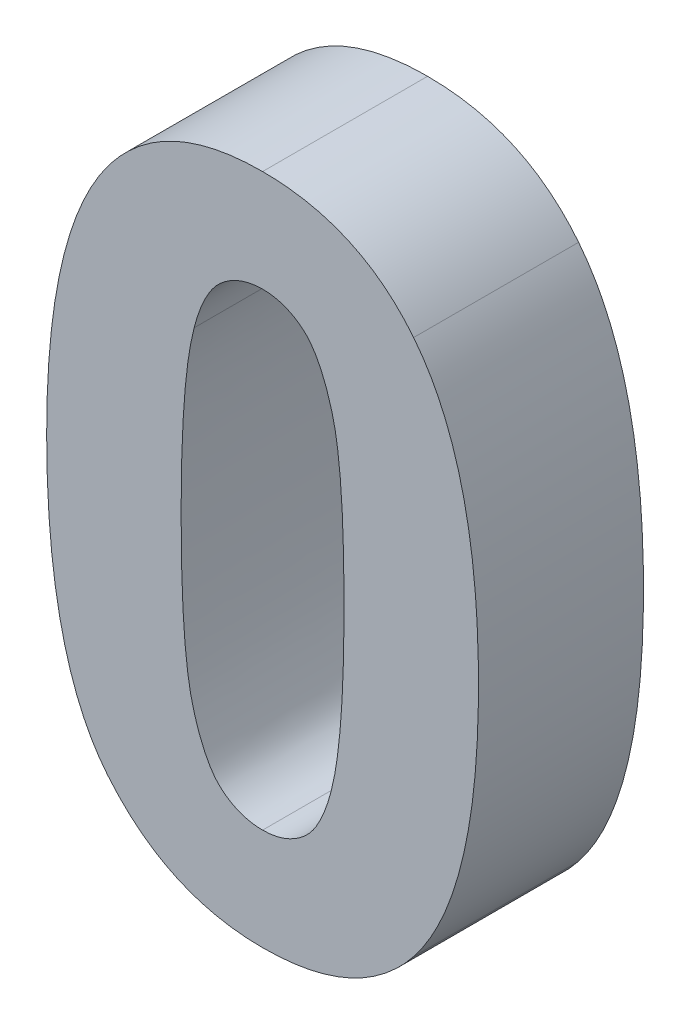
ISO-10303-21;
HEADER;
FILE_DESCRIPTION(('STEP AP214'),'2;1');
FILE_NAME('part.step','',(''),(''),'','','');
FILE_SCHEMA(('AUTOMOTIVE_DESIGN { 1 0 10303 214 1 1 1 1 }'));
ENDSEC;
DATA;
#1=APPLICATION_CONTEXT('core data for automotive mechanical design processes');
#2=APPLICATION_PROTOCOL_DEFINITION('international standard','automotive_design',2000,#1);
#3=PRODUCT_CONTEXT('',#1,'mechanical');
#4=PRODUCT('Part','Part','',(#3));
#5=PRODUCT_RELATED_PRODUCT_CATEGORY('part','',(#4));
#6=PRODUCT_DEFINITION_FORMATION('','',#4);
#7=PRODUCT_DEFINITION_CONTEXT('part definition',#1,'design');
#8=PRODUCT_DEFINITION('design','',#6,#7);
#9=PRODUCT_DEFINITION_SHAPE('','',#8);
#10=(LENGTH_UNIT() NAMED_UNIT(*) SI_UNIT(.MILLI.,.METRE.));
#11=(NAMED_UNIT(*) PLANE_ANGLE_UNIT() SI_UNIT($,.RADIAN.));
#12=(NAMED_UNIT(*) SI_UNIT($,.STERADIAN.) SOLID_ANGLE_UNIT());
#13=UNCERTAINTY_MEASURE_WITH_UNIT(LENGTH_MEASURE(1.E-05),#10,'distance_accuracy_value','');
#14=(GEOMETRIC_REPRESENTATION_CONTEXT(3) GLOBAL_UNCERTAINTY_ASSIGNED_CONTEXT((#13)) GLOBAL_UNIT_ASSIGNED_CONTEXT((#10,
#11,#12)) REPRESENTATION_CONTEXT('',''));
#15=CARTESIAN_POINT('',(0.,0.,0.));
#16=DIRECTION('',(0.,0.,1.));
#17=DIRECTION('',(1.,0.,0.));
#18=AXIS2_PLACEMENT_3D('',#15,#16,#17);
#19=CARTESIAN_POINT('',(0.412203937068,0.113162769524,0.774985954115));
#20=DIRECTION('',(0.,0.,1.));
#21=DIRECTION('',(1.,0.,0.));
#22=AXIS2_PLACEMENT_3D('',#19,#20,#21);
#23=PLANE('',#22);
#24=CARTESIAN_POINT('',(0.543068134599,0.113162769524,0.774985954115));
#25=CARTESIAN_POINT('',(0.601632976493,0.113162769524,0.774985954115));
#26=CARTESIAN_POINT('',(0.634349035295,0.153980690774,0.774985954115));
#27=B_SPLINE_CURVE_WITH_KNOTS('',2,(#24,#25,#26),.UNSPECIFIED.,.F.,.F.,(3,3),(0.,1.),.UNSPECIFIED.);
#28=CARTESIAN_POINT('',(0.634349035295,0.153980690774,0.774985954115));
#29=VERTEX_POINT('',#28);
#30=CARTESIAN_POINT('',(0.543068134599,0.113162769524,0.774985954115));
#31=VERTEX_POINT('',#30);
#32=EDGE_CURVE('E160',#29,#31,#27,.F.);
#33=ORIENTED_EDGE('',*,*,#32,.F.);
#34=CARTESIAN_POINT('',(0.634619063468,0.479212161659,0.774985954115));
#35=CARTESIAN_POINT('',(0.640025402949176,0.472447419636685,0.774985954115));
#36=CARTESIAN_POINT('',(0.644611120418053,0.465147016002518,0.774985954115));
#37=CARTESIAN_POINT('',(0.652388335620454,0.449985067460644,0.774985954115));
#38=CARTESIAN_POINT('',(0.6556027750927,0.442135543387871,0.774985954115));
#39=CARTESIAN_POINT('',(0.663133811607039,0.420002062466839,0.774985954115));
#40=CARTESIAN_POINT('',(0.666414112109756,0.405386985115071,0.774985954115));
#41=CARTESIAN_POINT('',(0.67110864527515,0.375726196064851,0.774985954115));
#42=CARTESIAN_POINT('',(0.672498987227943,0.360677383301054,0.774985954115));
#43=CARTESIAN_POINT('',(0.673734050783575,0.335716440770398,0.774985954115));
#44=CARTESIAN_POINT('',(0.673946137324681,0.325819874262729,0.774985954115));
#45=CARTESIAN_POINT('',(0.673917574717606,0.306035237575412,0.774985954115));
#46=CARTESIAN_POINT('',(0.673677038163963,0.29614716589475,0.774985954115));
#47=CARTESIAN_POINT('',(0.672119723713211,0.266583677793478,0.774985954115));
#48=CARTESIAN_POINT('',(0.669972992035096,0.246913758388927,0.774985954115));
#49=CARTESIAN_POINT('',(0.663875359600649,0.218071954697812,0.774985954115));
#50=CARTESIAN_POINT('',(0.661376402943102,0.208599284598992,0.774985954115));
#51=CARTESIAN_POINT('',(0.655070453749767,0.190116325194422,0.774985954115));
#52=CARTESIAN_POINT('',(0.651270996941365,0.181103708421494,0.774985954115));
#53=CARTESIAN_POINT('',(0.643055594048154,0.166053464373779,0.774985954115));
#54=CARTESIAN_POINT('',(0.638998054530759,0.159816398554605,0.774985954115));
#55=CARTESIAN_POINT('',(0.634349035302135,0.15398069078293,0.774985954115));
#56=B_SPLINE_CURVE_WITH_KNOTS('',3,(#34,#35,#36,#37,#38,#39,#40,#41,#42,#43,#44,#45,#46,#47,#48,
#49,#50,#51,#52,#53,#54,#55),.UNSPECIFIED.,.F.,.F.,(4,2,2,2,2,2,2,2,2,2,4),(0.,
0.0257890190373717,0.0511278323204593,0.0958393905091153,0.141111043835148,0.170793939050839,
0.200469451324563,0.259534837633241,0.288870897633903,0.318039769929468,0.340309059718944),.UNSPECIFIED.);
#57=CARTESIAN_POINT('',(0.634619063468,0.479212161659,0.774985954115));
#58=VERTEX_POINT('',#57);
#59=EDGE_CURVE('E164',#58,#29,#56,.T.);
#60=ORIENTED_EDGE('',*,*,#59,.F.);
#61=CARTESIAN_POINT('',(0.634619063468,0.479212161659,0.774985954115));
#62=CARTESIAN_POINT('',(0.601632976493,0.520570176931,0.774985954115));
#63=CARTESIAN_POINT('',(0.543068134599,0.520570176931,0.774985954115));
#64=B_SPLINE_CURVE_WITH_KNOTS('',2,(#61,#62,#63),.UNSPECIFIED.,.F.,.F.,(3,3),(0.,1.),.UNSPECIFIED.);
#65=CARTESIAN_POINT('',(0.543068134599,0.520570176931,0.774985954115));
#66=VERTEX_POINT('',#65);
#67=EDGE_CURVE('E151',#66,#58,#64,.F.);
#68=ORIENTED_EDGE('',*,*,#67,.F.);
#69=CARTESIAN_POINT('',(0.543068134599,0.520570176931,0.774985954115));
#70=CARTESIAN_POINT('',(0.48450333038,0.520570176931,0.774985954115));
#71=CARTESIAN_POINT('',(0.451787271578,0.479752293358,0.774985954115));
#72=B_SPLINE_CURVE_WITH_KNOTS('',2,(#69,#70,#71),.UNSPECIFIED.,.F.,.F.,(3,3),(0.,1.),.UNSPECIFIED.);
#73=CARTESIAN_POINT('',(0.451787271578,0.479752293358,0.774985954115));
#74=VERTEX_POINT('',#73);
#75=EDGE_CURVE('E156',#74,#66,#72,.F.);
#76=ORIENTED_EDGE('',*,*,#75,.F.);
#77=CARTESIAN_POINT('',(0.543068134599,0.113162769524,0.774985954115));
#78=CARTESIAN_POINT('',(0.53603659712938,0.113147385568419,0.774985954115));
#79=CARTESIAN_POINT('',(0.528973995061719,0.113640908279239,0.774985954115));
#80=CARTESIAN_POINT('',(0.51504479361397,0.115770824384862,0.774985954115));
#81=CARTESIAN_POINT('',(0.508177774965833,0.117404545722434,0.774985954115));
#82=CARTESIAN_POINT('',(0.494805570146341,0.121958139703605,0.774985954115));
#83=CARTESIAN_POINT('',(0.488303999753412,0.124888942284537,0.774985954115));
#84=CARTESIAN_POINT('',(0.475992035554802,0.131957943030686,0.774985954115));
#85=CARTESIAN_POINT('',(0.470182095107515,0.136096927081473,0.774985954115));
#86=CARTESIAN_POINT('',(0.460038879214217,0.144806076848938,0.774985954115));
#87=CARTESIAN_POINT('',(0.45561244074508,0.14926999803233,0.774985954115));
#88=CARTESIAN_POINT('',(0.449448371615497,0.15636477987913,0.774985954115));
#89=CARTESIAN_POINT('',(0.447474385840832,0.158794013054974,0.774985954115));
#90=CARTESIAN_POINT('',(0.443775781811236,0.163833699510241,0.774985954115));
#91=CARTESIAN_POINT('',(0.442050925718922,0.16644397637991,0.774985954115));
#92=CARTESIAN_POINT('',(0.435985718916794,0.176490858652957,0.774985954115));
#93=CARTESIAN_POINT('',(0.432365869620252,0.18436035492817,0.774985954115));
#94=CARTESIAN_POINT('',(0.426309814779601,0.200565113982904,0.774985954115));
#95=CARTESIAN_POINT('',(0.42388236439014,0.20890333522483,0.774985954115));
#96=CARTESIAN_POINT('',(0.418990794883532,0.229476055595133,0.774985954115));
#97=CARTESIAN_POINT('',(0.41697792240079,0.241814849156619,0.774985954115));
#98=CARTESIAN_POINT('',(0.41408330315969,0.266626879711769,0.774985954115));
#99=CARTESIAN_POINT('',(0.4132038341678,0.279100336794058,0.774985954115));
#100=CARTESIAN_POINT('',(0.41219318826535,0.304108750947516,0.774985954115));
#101=CARTESIAN_POINT('',(0.412064046077152,0.316643783074157,0.774985954115));
#102=CARTESIAN_POINT('',(0.412560271611252,0.341695191493064,0.774985954115));
#103=CARTESIAN_POINT('',(0.413185141638461,0.354211574637289,0.774985954115));
#104=CARTESIAN_POINT('',(0.415465406558391,0.378463635653766,0.774985954115));
#105=CARTESIAN_POINT('',(0.417062131395607,0.390204335408739,0.774985954115));
#106=CARTESIAN_POINT('',(0.421585408265183,0.413323230148103,0.774985954115));
#107=CARTESIAN_POINT('',(0.424497995135726,0.424703922023218,0.774985954115));
#108=CARTESIAN_POINT('',(0.431100277211865,0.443574145404348,0.774985954115));
#109=CARTESIAN_POINT('',(0.434308538928756,0.45122261208562,0.774985954115));
#110=CARTESIAN_POINT('',(0.44200466651145,0.466007783582387,0.774985954115));
#111=CARTESIAN_POINT('',(0.446514375430342,0.473132900072558,0.774985954115));
#112=CARTESIAN_POINT('',(0.451787271578,0.479752293358,0.774985954115));
#113=B_SPLINE_CURVE_WITH_KNOTS('',3,(#77,#78,#79,#80,#81,#82,#83,#84,#85,#86,#87,#88,#89,#90,
#91,#92,#93,#94,#95,#96,#97,#98,#99,#100,#101,#102,#103,#104,#105,#106,#107,#108,#109,#110,#111,
#112),.UNSPECIFIED.,.F.,.F.,(4,2,2,2,2,2,2,2,2,2,2,2,2,2,2,2,2,4),(0.,0.0211234126625945,
0.0421974880755371,0.0634526307826925,0.0847216302454277,0.103515283291567,0.112896576888495,
0.122268854366455,0.148084284175426,0.174086530605207,0.211497846994412,0.248984231120665,
0.286572222856889,0.324135417739965,0.35962918728143,0.394754804479699,0.419536410818635,
0.444760886656831),.UNSPECIFIED.);
#114=EDGE_CURVE('E111',#31,#74,#113,.T.);
#115=ORIENTED_EDGE('',*,*,#114,.F.);
#116=EDGE_LOOP('',(#33,#60,#68,#76,#115));
#117=FACE_BOUND('',#116,.T.);
#118=CARTESIAN_POINT('',(0.543068134599,0.174891164586,0.774985954115));
#119=CARTESIAN_POINT('',(0.545208923953885,0.174885196084678,0.774985954115));
#120=CARTESIAN_POINT('',(0.547354775072204,0.17505144417224,0.774985954115));
#121=CARTESIAN_POINT('',(0.5515767803911,0.175736892805414,0.774985954115));
#122=CARTESIAN_POINT('',(0.553653248933218,0.176254178354482,0.774985954115));
#123=CARTESIAN_POINT('',(0.557692135273333,0.177653693529607,0.774985954115));
#124=CARTESIAN_POINT('',(0.559653880214381,0.178537869373538,0.774985954115));
#125=CARTESIAN_POINT('',(0.563401954526304,0.180607785697536,0.774985954115));
#126=CARTESIAN_POINT('',(0.565188731859555,0.181792726597005,0.774985954115));
#127=CARTESIAN_POINT('',(0.568578494997168,0.184481823732958,0.774985954115));
#128=CARTESIAN_POINT('',(0.57017624533013,0.185992757681112,0.774985954115));
#129=CARTESIAN_POINT('',(0.573043787897579,0.189299317745726,0.774985954115));
#130=CARTESIAN_POINT('',(0.574312936620614,0.191095491529316,0.774985954115));
#131=CARTESIAN_POINT('',(0.57739757236309,0.196100189158803,0.774985954115));
#132=CARTESIAN_POINT('',(0.578995683190902,0.199436783467688,0.774985954115));
#133=CARTESIAN_POINT('',(0.581743791678822,0.206289160862213,0.774985954115));
#134=CARTESIAN_POINT('',(0.582892377627103,0.20980546986014,0.774985954115));
#135=CARTESIAN_POINT('',(0.584126872113973,0.214219827719381,0.774985954115));
#136=CARTESIAN_POINT('',(0.58435763934395,0.215079317745306,0.774985954115));
#137=CARTESIAN_POINT('',(0.58458051089,0.215940570849,0.774985954115));
#138=B_SPLINE_CURVE_WITH_KNOTS('',3,(#118,#119,#120,#121,#122,#123,#124,#125,#126,#127,#128,
#129,#130,#131,#132,#133,#134,#135,#136,#137),.UNSPECIFIED.,.F.,.F.,(4,2,2,2,2,2,2,2,2,4),(0.,
0.00642316958680281,0.0128115779126841,0.019234316612511,0.0256401561716451,0.0321948463670456,
0.0387622773657507,0.0498068519792327,0.0608858384591105,0.0635553060288045),.UNSPECIFIED.);
#139=CARTESIAN_POINT('',(0.543068134599,0.174891164586,0.774985954115));
#140=VERTEX_POINT('',#139);
#141=CARTESIAN_POINT('',(0.58458051089,0.215940570849,0.774985954115));
#142=VERTEX_POINT('',#141);
#143=EDGE_CURVE('E23',#140,#142,#138,.T.);
#144=ORIENTED_EDGE('',*,*,#143,.F.);
#145=CARTESIAN_POINT('',(0.501555795984,0.417792413282,0.774985954115));
#146=CARTESIAN_POINT('',(0.500549927274585,0.413878532950343,0.774985954115));
#147=CARTESIAN_POINT('',(0.499724871929037,0.409926982187529,0.774985954115));
#148=CARTESIAN_POINT('',(0.498333535300726,0.401983707941821,0.774985954115));
#149=CARTESIAN_POINT('',(0.497766855963113,0.397992056002872,0.774985954115));
#150=CARTESIAN_POINT('',(0.49629977097016,0.386013805350118,0.774985954115));
#151=CARTESIAN_POINT('',(0.495627812500718,0.378001475174588,0.774985954115));
#152=CARTESIAN_POINT('',(0.494620724002767,0.361955180673516,0.774985954115));
#153=CARTESIAN_POINT('',(0.494285752330804,0.353921207954079,0.774985954115));
#154=CARTESIAN_POINT('',(0.493831450414492,0.337508406945025,0.774985954115));
#155=CARTESIAN_POINT('',(0.49372181785283,0.329129334450638,0.774985954115));
#156=CARTESIAN_POINT('',(0.493661920041258,0.312366080718216,0.774985954115));
#157=CARTESIAN_POINT('',(0.493711743870825,0.303981899241597,0.774985954115));
#158=CARTESIAN_POINT('',(0.494003861372116,0.287219305047304,0.774985954115));
#159=CARTESIAN_POINT('',(0.494246102281956,0.278840891378311,0.774985954115));
#160=CARTESIAN_POINT('',(0.49502769826335,0.26226707397942,0.774985954115));
#161=CARTESIAN_POINT('',(0.49556080566483,0.254071468604383,0.774985954115));
#162=CARTESIAN_POINT('',(0.496788211120961,0.241853352140994,0.774985954115));
#163=CARTESIAN_POINT('',(0.497265903714845,0.237809109581354,0.774985954115));
#164=CARTESIAN_POINT('',(0.498447674240565,0.229754982292495,0.774985954115));
#165=CARTESIAN_POINT('',(0.499151375143517,0.225745051681591,0.774985954115));
#166=CARTESIAN_POINT('',(0.500848379068904,0.218491759888217,0.774985954115));
#167=CARTESIAN_POINT('',(0.501773515011006,0.215232409274413,0.774985954115));
#168=CARTESIAN_POINT('',(0.50381774239829,0.208775687978744,0.774985954115));
#169=CARTESIAN_POINT('',(0.504936758622294,0.205578293792124,0.774985954115));
#170=CARTESIAN_POINT('',(0.507299561136937,0.199845433456644,0.774985954115));
#171=CARTESIAN_POINT('',(0.508491106585896,0.197288757426959,0.774985954115));
#172=CARTESIAN_POINT('',(0.511189533857665,0.192358982850565,0.774985954115));
#173=CARTESIAN_POINT('',(0.51269360642041,0.18998449079034,0.774985954115));
#174=CARTESIAN_POINT('',(0.515721297952079,0.186306702856265,0.774985954115));
#175=CARTESIAN_POINT('',(0.517107446128857,0.184894341223999,0.774985954115));
#176=CARTESIAN_POINT('',(0.520120672566333,0.182351200107708,0.774985954115));
#177=CARTESIAN_POINT('',(0.52174852627914,0.181221359551111,0.774985954115));
#178=CARTESIAN_POINT('',(0.525133083092527,0.179208080139027,0.774985954115));
#179=CARTESIAN_POINT('',(0.526888814953812,0.178322987773699,0.774985954115));
#180=CARTESIAN_POINT('',(0.530525376087166,0.176854466344686,0.774985954115));
#181=CARTESIAN_POINT('',(0.532406229081961,0.176271094671694,0.774985954115));
#182=CARTESIAN_POINT('',(0.535754080620028,0.175516470204178,0.774985954115));
#183=CARTESIAN_POINT('',(0.537206871179472,0.175278621417635,0.774985954115));
#184=CARTESIAN_POINT('',(0.540129370361142,0.174965358676301,0.774985954115));
#185=CARTESIAN_POINT('',(0.541599070762769,0.174889868889453,0.774985954115));
#186=CARTESIAN_POINT('',(0.543068134599,0.174891164586,0.774985954115));
#187=B_SPLINE_CURVE_WITH_KNOTS('',3,(#145,#146,#147,#148,#149,#150,#151,#152,#153,#154,#155,
#156,#157,#158,#159,#160,#161,#162,#163,#164,#165,#166,#167,#168,#169,#170,#171,#172,#173,#174,
#175,#176,#177,#178,#179,#180,#181,#182,#183,#184,#185,#186),.UNSPECIFIED.,.F.,.F.,(4,2,2,2,2,2,
2,2,2,2,2,2,2,2,2,2,2,2,2,2,4),(0.,0.012106829170419,0.024194942972478,0.04830278128329,
0.0724219430443959,0.0975590405711289,0.122710183256129,0.147854431730961,0.172478717460217,
0.184694211727478,0.196889432941697,0.207043916206111,0.217194468546181,0.225645891403105,
0.234024399501272,0.239923751126846,0.245842455530952,0.251720138015803,0.25759893809165,
0.262006718644212,0.266412440033305),.UNSPECIFIED.);
#188=CARTESIAN_POINT('',(0.501555795984,0.417792413282,0.774985954115));
#189=VERTEX_POINT('',#188);
#190=EDGE_CURVE('E97',#189,#140,#187,.T.);
#191=ORIENTED_EDGE('',*,*,#190,.F.);
#192=CARTESIAN_POINT('',(0.543068134599,0.458841781869,0.774985954115));
#193=CARTESIAN_POINT('',(0.540927347078876,0.458847750383356,0.774985954115));
#194=CARTESIAN_POINT('',(0.538781497883667,0.458681502009389,0.774985954115));
#195=CARTESIAN_POINT('',(0.534559496685078,0.457996052833444,0.774985954115));
#196=CARTESIAN_POINT('',(0.532483030334277,0.457478767060993,0.774985954115));
#197=CARTESIAN_POINT('',(0.52844414850407,0.456079252141642,0.774985954115));
#198=CARTESIAN_POINT('',(0.526482405872245,0.455195076806976,0.774985954115));
#199=CARTESIAN_POINT('',(0.522734335317447,0.453125162969391,0.774985954115));
#200=CARTESIAN_POINT('',(0.520947559434106,0.451940224043657,0.774985954115));
#201=CARTESIAN_POINT('',(0.517557794407303,0.449251127387288,0.774985954115));
#202=CARTESIAN_POINT('',(0.515960041337541,0.44774019115615,0.774985954115));
#203=CARTESIAN_POINT('',(0.513092495009457,0.444433625209727,0.774985954115));
#204=CARTESIAN_POINT('',(0.511823345271229,0.442637447820338,0.774985954115));
#205=CARTESIAN_POINT('',(0.508738710694691,0.437632744958523,0.774985954115));
#206=CARTESIAN_POINT('',(0.507140601725327,0.434296149444962,0.774985954115));
#207=CARTESIAN_POINT('',(0.50439249676461,0.427443770024111,0.774985954115));
#208=CARTESIAN_POINT('',(0.503243912475822,0.423927460208733,0.774985954115));
#209=CARTESIAN_POINT('',(0.502009424927712,0.419513119829783,0.774985954115));
#210=CARTESIAN_POINT('',(0.501778662777613,0.418653648059329,0.774985954115));
#211=CARTESIAN_POINT('',(0.501555795984,0.417792413282,0.774985954115));
#212=B_SPLINE_CURVE_WITH_KNOTS('',3,(#192,#193,#194,#195,#196,#197,#198,#199,#200,#201,#202,
#203,#204,#205,#206,#207,#208,#209,#210,#211),.UNSPECIFIED.,.F.,.F.,(4,2,2,2,2,2,2,2,2,4),(0.,
0.00642316392402582,0.0128115660177765,0.0192342979839968,0.0256401308177535,0.0321948312814212,
0.0387622726723534,0.0498068482702252,0.0608858355289108,0.063555246274724),.UNSPECIFIED.);
#213=CARTESIAN_POINT('',(0.543068134599,0.458841781869,0.774985954115));
#214=VERTEX_POINT('',#213);
#215=EDGE_CURVE('E116',#214,#189,#212,.T.);
#216=ORIENTED_EDGE('',*,*,#215,.F.);
#217=CARTESIAN_POINT('',(0.58458051089,0.215940570849,0.774985954115));
#218=CARTESIAN_POINT('',(0.58557494841717,0.219775106786449,0.774985954115));
#219=CARTESIAN_POINT('',(0.586391439788656,0.223647080700851,0.774985954115));
#220=CARTESIAN_POINT('',(0.587769805557983,0.231431014817689,0.774985954115));
#221=CARTESIAN_POINT('',(0.588332075223722,0.235342903207848,0.774985954115));
#222=CARTESIAN_POINT('',(0.589789662234229,0.24708102710153,0.774985954115));
#223=CARTESIAN_POINT('',(0.590460462430582,0.254932919590273,0.774985954115));
#224=CARTESIAN_POINT('',(0.591471052997512,0.270657987127001,0.774985954115));
#225=CARTESIAN_POINT('',(0.591810706858408,0.278531169611471,0.774985954115));
#226=CARTESIAN_POINT('',(0.592278539660298,0.294609037741964,0.774985954115));
#227=CARTESIAN_POINT('',(0.59239739509622,0.302813971607716,0.774985954115));
#228=CARTESIAN_POINT('',(0.592478441693658,0.319229217040421,0.774985954115));
#229=CARTESIAN_POINT('',(0.592440541853839,0.32743952896376,0.774985954115));
#230=CARTESIAN_POINT('',(0.592187173736984,0.343854981460446,0.774985954115));
#231=CARTESIAN_POINT('',(0.591971751911491,0.352060122824734,0.774985954115));
#232=CARTESIAN_POINT('',(0.591255569177279,0.368703003157703,0.774985954115));
#233=CARTESIAN_POINT('',(0.590746638871139,0.377140518752572,0.774985954115));
#234=CARTESIAN_POINT('',(0.589554788545094,0.389715595559615,0.774985954115));
#235=CARTESIAN_POINT('',(0.589089330067676,0.393874041551417,0.774985954115));
#236=CARTESIAN_POINT('',(0.587944688861333,0.402164764635647,0.774985954115));
#237=CARTESIAN_POINT('',(0.587265637001847,0.406297056175677,0.774985954115));
#238=CARTESIAN_POINT('',(0.58559993074132,0.413750612932174,0.774985954115));
#239=CARTESIAN_POINT('',(0.58468698907851,0.417088311390957,0.774985954115));
#240=CARTESIAN_POINT('',(0.582655784711491,0.423700017883475,0.774985954115));
#241=CARTESIAN_POINT('',(0.581537611916966,0.42697405311549,0.774985954115));
#242=CARTESIAN_POINT('',(0.578944778072955,0.433455813812638,0.774985954115));
#243=CARTESIAN_POINT('',(0.577463176500693,0.436660737454766,0.774985954115));
#244=CARTESIAN_POINT('',(0.573974712491105,0.442765706717738,0.774985954115));
#245=CARTESIAN_POINT('',(0.571975905330139,0.445669546595417,0.774985954115));
#246=CARTESIAN_POINT('',(0.568104355985839,0.44956285785194,0.774985954115));
#247=CARTESIAN_POINT('',(0.566530581498793,0.450844354223533,0.774985954115));
#248=CARTESIAN_POINT('',(0.563212294537966,0.453172217916947,0.774985954115));
#249=CARTESIAN_POINT('',(0.561466941583999,0.454217335641856,0.774985954115));
#250=CARTESIAN_POINT('',(0.557827382113097,0.455999117630732,0.774985954115));
#251=CARTESIAN_POINT('',(0.55593362024695,0.456736664380564,0.774985954115));
#252=CARTESIAN_POINT('',(0.552056044388597,0.457880154294491,0.774985954115));
#253=CARTESIAN_POINT('',(0.550072493994901,0.458287009114784,0.774985954115));
#254=CARTESIAN_POINT('',(0.546410390493168,0.458744796013719,0.774985954115));
#255=CARTESIAN_POINT('',(0.544737900554444,0.458844819335847,0.774985954115));
#256=CARTESIAN_POINT('',(0.543068134599,0.458841781869,0.774985954115));
#257=B_SPLINE_CURVE_WITH_KNOTS('',3,(#217,#218,#219,#220,#221,#222,#223,#224,#225,#226,#227,
#228,#229,#230,#231,#232,#233,#234,#235,#236,#237,#238,#239,#240,#241,#242,#243,#244,#245,#246,
#247,#248,#249,#250,#251,#252,#253,#254,#255,#256),.UNSPECIFIED.,.F.,.F.,(4,2,2,2,2,2,2,2,2,2,2,
2,2,2,2,2,2,2,2,4),(0.,0.0118679572649664,0.0237173980479432,0.0473455433909252,
0.0709834249385654,0.0955985621197394,0.120227991162318,0.144850977555918,0.170194866681176,
0.182747210624896,0.195291878634011,0.205662293960728,0.216028176910556,0.226609982379214,
0.237035978929244,0.243087588531018,0.249170478296501,0.255235792849483,0.261284329196669,
0.266295066014164),.UNSPECIFIED.);
#258=EDGE_CURVE('E99',#142,#214,#257,.T.);
#259=ORIENTED_EDGE('',*,*,#258,.F.);
#260=EDGE_LOOP('',(#144,#191,#216,#259));
#261=FACE_BOUND('',#260,.T.);
#262=ADVANCED_FACE('F17',(#117,#261),#23,.T.);
#263=CARTESIAN_POINT('',(0.543068134599,0.174891164586,0.674985954115));
#264=CARTESIAN_POINT('',(0.5569184662,0.174891164586,0.674985954115));
#265=CARTESIAN_POINT('',(0.567759511461,0.183841786579,0.674985954115));
#266=CARTESIAN_POINT('',(0.578600556723,0.192792408573,0.674985954115));
#267=CARTESIAN_POINT('',(0.58458051089,0.215940570849,0.674985954115));
#268=CARTESIAN_POINT('',(0.543068134599,0.174891164586,0.774985954115));
#269=CARTESIAN_POINT('',(0.5569184662,0.174891164586,0.774985954115));
#270=CARTESIAN_POINT('',(0.567759511461,0.183841786579,0.774985954115));
#271=CARTESIAN_POINT('',(0.578600556723,0.192792408573,0.774985954115));
#272=CARTESIAN_POINT('',(0.58458051089,0.215940570849,0.774985954115));
#273=B_SPLINE_SURFACE_WITH_KNOTS('',1,2,((#263,#264,#265,#266,#267),(#268,#269,#270,#271,#272)),
.UNSPECIFIED.,.F.,.F.,.F.,(2,2),(3,2,3),(0.,0.1),(6.,7.,8.),.UNSPECIFIED.);
#274=DIRECTION('',(0.,0.,-1.));
#275=VECTOR('',#274,1.);
#276=CARTESIAN_POINT('',(0.543068134599,0.174891164586,0.724985954115));
#277=LINE('',#276,#275);
#278=CARTESIAN_POINT('',(0.543068134599,0.174891164586,0.674985954115));
#279=VERTEX_POINT('',#278);
#280=EDGE_CURVE('E104',#140,#279,#277,.T.);
#281=DIRECTION('',(0.,0.,1.));
#282=VECTOR('',#281,1.);
#283=CARTESIAN_POINT('',(0.58458051089,0.215940570849,0.724985954115));
#284=LINE('',#283,#282);
#285=CARTESIAN_POINT('',(0.58458051089,0.215940570849,0.674985954115));
#286=VERTEX_POINT('',#285);
#287=EDGE_CURVE('E102',#286,#142,#284,.T.);
#288=CARTESIAN_POINT('',(0.543068134599,0.174891164586,0.674985954115));
#289=CARTESIAN_POINT('',(0.545208923953885,0.174885196084678,0.674985954115));
#290=CARTESIAN_POINT('',(0.547354775072204,0.17505144417224,0.674985954115));
#291=CARTESIAN_POINT('',(0.5515767803911,0.175736892805414,0.674985954115));
#292=CARTESIAN_POINT('',(0.553653248933218,0.176254178354482,0.674985954115));
#293=CARTESIAN_POINT('',(0.557692135273333,0.177653693529607,0.674985954115));
#294=CARTESIAN_POINT('',(0.559653880214381,0.178537869373538,0.674985954115));
#295=CARTESIAN_POINT('',(0.563401954526304,0.180607785697536,0.674985954115));
#296=CARTESIAN_POINT('',(0.565188731859555,0.181792726597005,0.674985954115));
#297=CARTESIAN_POINT('',(0.568578494997168,0.184481823732958,0.674985954115));
#298=CARTESIAN_POINT('',(0.57017624533013,0.185992757681112,0.674985954115));
#299=CARTESIAN_POINT('',(0.573043787897579,0.189299317745726,0.674985954115));
#300=CARTESIAN_POINT('',(0.574312936620614,0.191095491529316,0.674985954115));
#301=CARTESIAN_POINT('',(0.57739757236309,0.196100189158803,0.674985954115));
#302=CARTESIAN_POINT('',(0.578995683190902,0.199436783467688,0.674985954115));
#303=CARTESIAN_POINT('',(0.581743791678822,0.206289160862213,0.674985954115));
#304=CARTESIAN_POINT('',(0.582892377627103,0.20980546986014,0.674985954115));
#305=CARTESIAN_POINT('',(0.584126872113973,0.214219827719381,0.674985954115));
#306=CARTESIAN_POINT('',(0.58435763934395,0.215079317745306,0.674985954115));
#307=CARTESIAN_POINT('',(0.58458051089,0.215940570849,0.674985954115));
#308=B_SPLINE_CURVE_WITH_KNOTS('',3,(#288,#289,#290,#291,#292,#293,#294,#295,#296,#297,#298,
#299,#300,#301,#302,#303,#304,#305,#306,#307),.UNSPECIFIED.,.F.,.F.,(4,2,2,2,2,2,2,2,2,4),(0.,
0.00642316958680281,0.0128115779126841,0.019234316612511,0.0256401561716451,0.0321948463670456,
0.0387622773657506,0.0498068519792327,0.0608858384591105,0.0635553060288045),.UNSPECIFIED.);
#309=EDGE_CURVE('E107',#279,#286,#308,.T.);
#310=ORIENTED_EDGE('',*,*,#280,.F.);
#311=ORIENTED_EDGE('',*,*,#143,.T.);
#312=ORIENTED_EDGE('',*,*,#287,.F.);
#313=ORIENTED_EDGE('',*,*,#309,.F.);
#314=EDGE_LOOP('',(#310,#311,#312,#313));
#315=FACE_BOUND('',#314,.T.);
#316=ADVANCED_FACE('F105',(#315),#273,.T.);
#317=CARTESIAN_POINT('',(0.58458051089,0.215940570849,0.674985954115));
#318=CARTESIAN_POINT('',(0.592450850648,0.245685942986,0.674985954115));
#319=CARTESIAN_POINT('',(0.592450850648,0.316712168723,0.674985954115));
#320=CARTESIAN_POINT('',(0.592450850648,0.387776975296,0.674985954115));
#321=CARTESIAN_POINT('',(0.585390670761,0.414358775428,0.674985954115));
#322=CARTESIAN_POINT('',(0.578330490874,0.440940575559,0.674985954115));
#323=CARTESIAN_POINT('',(0.567624478537,0.449891178714,0.674985954115));
#324=CARTESIAN_POINT('',(0.5569184662,0.458841781869,0.674985954115));
#325=CARTESIAN_POINT('',(0.543068134599,0.458841781869,0.674985954115));
#326=CARTESIAN_POINT('',(0.58458051089,0.215940570849,0.774985954115));
#327=CARTESIAN_POINT('',(0.592450850648,0.245685942986,0.774985954115));
#328=CARTESIAN_POINT('',(0.592450850648,0.316712168723,0.774985954115));
#329=CARTESIAN_POINT('',(0.592450850648,0.387776975296,0.774985954115));
#330=CARTESIAN_POINT('',(0.585390670761,0.414358775428,0.774985954115));
#331=CARTESIAN_POINT('',(0.578330490874,0.440940575559,0.774985954115));
#332=CARTESIAN_POINT('',(0.567624478537,0.449891178714,0.774985954115));
#333=CARTESIAN_POINT('',(0.5569184662,0.458841781869,0.774985954115));
#334=CARTESIAN_POINT('',(0.543068134599,0.458841781869,0.774985954115));
#335=B_SPLINE_SURFACE_WITH_KNOTS('',1,2,((#317,#318,#319,#320,#321,#322,#323,#324,#325),(#326,
#327,#328,#329,#330,#331,#332,#333,#334)),.UNSPECIFIED.,.F.,.F.,.F.,(2,2),(3,2,2,2,3),(0.,0.1),
(8.,9.,10.,11.,12.),.UNSPECIFIED.);
#336=DIRECTION('',(0.,0.,1.));
#337=VECTOR('',#336,1.);
#338=CARTESIAN_POINT('',(0.543068134599,0.458841781869,0.724985954115));
#339=LINE('',#338,#337);
#340=CARTESIAN_POINT('',(0.543068134599,0.458841781869,0.674985954115));
#341=VERTEX_POINT('',#340);
#342=EDGE_CURVE('E173',#341,#214,#339,.T.);
#343=CARTESIAN_POINT('',(0.58458051089,0.215940570849,0.674985954115));
#344=CARTESIAN_POINT('',(0.58557494841717,0.219775106786449,0.674985954115));
#345=CARTESIAN_POINT('',(0.586391439788656,0.223647080700851,0.674985954115));
#346=CARTESIAN_POINT('',(0.587769805557983,0.231431014817689,0.674985954115));
#347=CARTESIAN_POINT('',(0.588332075223722,0.235342903207848,0.674985954115));
#348=CARTESIAN_POINT('',(0.589789662234229,0.24708102710153,0.674985954115));
#349=CARTESIAN_POINT('',(0.590460462430581,0.254932919590273,0.674985954115));
#350=CARTESIAN_POINT('',(0.591471052997512,0.270657987127001,0.674985954115));
#351=CARTESIAN_POINT('',(0.591810706858408,0.278531169611471,0.674985954115));
#352=CARTESIAN_POINT('',(0.592278539660298,0.294609037741964,0.674985954115));
#353=CARTESIAN_POINT('',(0.59239739509622,0.302813971607716,0.674985954115));
#354=CARTESIAN_POINT('',(0.592478441693659,0.319229217040421,0.674985954115));
#355=CARTESIAN_POINT('',(0.592440541853839,0.32743952896376,0.674985954115));
#356=CARTESIAN_POINT('',(0.592187173736984,0.343854981460446,0.674985954115));
#357=CARTESIAN_POINT('',(0.591971751911491,0.352060122824734,0.674985954115));
#358=CARTESIAN_POINT('',(0.591255569177279,0.368703003157703,0.674985954115));
#359=CARTESIAN_POINT('',(0.590746638871139,0.377140518752572,0.674985954115));
#360=CARTESIAN_POINT('',(0.589554788545094,0.389715595559615,0.674985954115));
#361=CARTESIAN_POINT('',(0.589089330067676,0.393874041551417,0.674985954115));
#362=CARTESIAN_POINT('',(0.587944688861333,0.402164764635647,0.674985954115));
#363=CARTESIAN_POINT('',(0.587265637001847,0.406297056175677,0.674985954115));
#364=CARTESIAN_POINT('',(0.58559993074132,0.413750612932174,0.674985954115));
#365=CARTESIAN_POINT('',(0.58468698907851,0.417088311390957,0.674985954115));
#366=CARTESIAN_POINT('',(0.582655784711491,0.423700017883475,0.674985954115));
#367=CARTESIAN_POINT('',(0.581537611916966,0.42697405311549,0.674985954115));
#368=CARTESIAN_POINT('',(0.578944778072955,0.433455813812638,0.674985954115));
#369=CARTESIAN_POINT('',(0.577463176500693,0.436660737454766,0.674985954115));
#370=CARTESIAN_POINT('',(0.573974712491105,0.442765706717738,0.674985954115));
#371=CARTESIAN_POINT('',(0.571975905330139,0.445669546595417,0.674985954115));
#372=CARTESIAN_POINT('',(0.568104355985839,0.44956285785194,0.674985954115));
#373=CARTESIAN_POINT('',(0.566530581498793,0.450844354223533,0.674985954115));
#374=CARTESIAN_POINT('',(0.563212294537966,0.453172217916947,0.674985954115));
#375=CARTESIAN_POINT('',(0.561466941583999,0.454217335641856,0.674985954115));
#376=CARTESIAN_POINT('',(0.557827382113097,0.455999117630732,0.674985954115));
#377=CARTESIAN_POINT('',(0.55593362024695,0.456736664380564,0.674985954115));
#378=CARTESIAN_POINT('',(0.552056044388597,0.457880154294491,0.674985954115));
#379=CARTESIAN_POINT('',(0.550072493994901,0.458287009114784,0.674985954115));
#380=CARTESIAN_POINT('',(0.546410390493168,0.458744796013719,0.674985954115));
#381=CARTESIAN_POINT('',(0.544737900554444,0.458844819335847,0.674985954115));
#382=CARTESIAN_POINT('',(0.543068134599,0.458841781869,0.674985954115));
#383=B_SPLINE_CURVE_WITH_KNOTS('',3,(#343,#344,#345,#346,#347,#348,#349,#350,#351,#352,#353,
#354,#355,#356,#357,#358,#359,#360,#361,#362,#363,#364,#365,#366,#367,#368,#369,#370,#371,#372,
#373,#374,#375,#376,#377,#378,#379,#380,#381,#382),.UNSPECIFIED.,.F.,.F.,(4,2,2,2,2,2,2,2,2,2,2,
2,2,2,2,2,2,2,2,4),(0.,0.0118679572649664,0.0237173980479432,0.0473455433909252,
0.0709834249385654,0.0955985621197394,0.120227991162318,0.144850977555918,0.170194866681176,
0.182747210624896,0.195291878634011,0.205662293960727,0.216028176910556,0.226609982379214,
0.237035978929244,0.243087588531018,0.249170478296501,0.255235792849483,0.261284329196669,
0.266295066014164),.UNSPECIFIED.);
#384=EDGE_CURVE('E191',#286,#341,#383,.T.);
#385=ORIENTED_EDGE('',*,*,#258,.T.);
#386=ORIENTED_EDGE('',*,*,#342,.F.);
#387=ORIENTED_EDGE('',*,*,#384,.F.);
#388=ORIENTED_EDGE('',*,*,#287,.T.);
#389=EDGE_LOOP('',(#385,#386,#387,#388));
#390=FACE_BOUND('',#389,.T.);
#391=ADVANCED_FACE('F174',(#390),#335,.T.);
#392=CARTESIAN_POINT('',(0.544730169869,0.458841781869,0.674985954115));
#393=CARTESIAN_POINT('',(0.543899152234,0.458841781869,0.674985954115));
#394=CARTESIAN_POINT('',(0.543068134599,0.458841781869,0.674985954115));
#395=CARTESIAN_POINT('',(0.529217840674,0.458841781869,0.674985954115));
#396=CARTESIAN_POINT('',(0.518376795412,0.449891178714,0.674985954115));
#397=CARTESIAN_POINT('',(0.50753575015,0.440940575559,0.674985954115));
#398=CARTESIAN_POINT('',(0.501555795984,0.417792413282,0.674985954115));
#399=CARTESIAN_POINT('',(0.544730169869,0.458841781869,0.774985954115));
#400=CARTESIAN_POINT('',(0.543899152234,0.458841781869,0.774985954115));
#401=CARTESIAN_POINT('',(0.543068134599,0.458841781869,0.774985954115));
#402=CARTESIAN_POINT('',(0.529217840674,0.458841781869,0.774985954115));
#403=CARTESIAN_POINT('',(0.518376795412,0.449891178714,0.774985954115));
#404=CARTESIAN_POINT('',(0.50753575015,0.440940575559,0.774985954115));
#405=CARTESIAN_POINT('',(0.501555795984,0.417792413282,0.774985954115));
#406=B_SPLINE_SURFACE_WITH_KNOTS('',1,2,((#392,#393,#394,#395,#396,#397,#398),(#399,#400,#401,
#402,#403,#404,#405)),.UNSPECIFIED.,.F.,.F.,.F.,(2,2),(3,2,2,3),(0.,0.1),(-0.06,0.,1.,2.),.UNSPECIFIED.);
#407=DIRECTION('',(0.,0.,1.));
#408=VECTOR('',#407,1.);
#409=CARTESIAN_POINT('',(0.501555795984,0.417792413282,0.724985954115));
#410=LINE('',#409,#408);
#411=CARTESIAN_POINT('',(0.501555795984,0.417792413282,0.674985954115));
#412=VERTEX_POINT('',#411);
#413=EDGE_CURVE('E114',#412,#189,#410,.T.);
#414=CARTESIAN_POINT('',(0.543068134599,0.458841781869,0.674985954115));
#415=CARTESIAN_POINT('',(0.540927347078876,0.458847750383356,0.674985954115));
#416=CARTESIAN_POINT('',(0.538781497883667,0.458681502009389,0.674985954115));
#417=CARTESIAN_POINT('',(0.534559496685078,0.457996052833444,0.674985954115));
#418=CARTESIAN_POINT('',(0.532483030334277,0.457478767060993,0.674985954115));
#419=CARTESIAN_POINT('',(0.52844414850407,0.456079252141642,0.674985954115));
#420=CARTESIAN_POINT('',(0.526482405872245,0.455195076806976,0.674985954115));
#421=CARTESIAN_POINT('',(0.522734335317447,0.453125162969391,0.674985954115));
#422=CARTESIAN_POINT('',(0.520947559434106,0.451940224043657,0.674985954115));
#423=CARTESIAN_POINT('',(0.517557794407303,0.449251127387288,0.674985954115));
#424=CARTESIAN_POINT('',(0.515960041337541,0.44774019115615,0.674985954115));
#425=CARTESIAN_POINT('',(0.513092495009457,0.444433625209727,0.674985954115));
#426=CARTESIAN_POINT('',(0.511823345271229,0.442637447820338,0.674985954115));
#427=CARTESIAN_POINT('',(0.508738710694691,0.437632744958523,0.674985954115));
#428=CARTESIAN_POINT('',(0.507140601725327,0.434296149444962,0.674985954115));
#429=CARTESIAN_POINT('',(0.50439249676461,0.427443770024111,0.674985954115));
#430=CARTESIAN_POINT('',(0.503243912475822,0.423927460208733,0.674985954115));
#431=CARTESIAN_POINT('',(0.502009424927712,0.419513119829783,0.674985954115));
#432=CARTESIAN_POINT('',(0.501778662777613,0.418653648059329,0.674985954115));
#433=CARTESIAN_POINT('',(0.501555795984,0.417792413282,0.674985954115));
#434=B_SPLINE_CURVE_WITH_KNOTS('',3,(#414,#415,#416,#417,#418,#419,#420,#421,#422,#423,#424,
#425,#426,#427,#428,#429,#430,#431,#432,#433),.UNSPECIFIED.,.F.,.F.,(4,2,2,2,2,2,2,2,2,4),(0.,
0.00642316392402582,0.0128115660177765,0.0192342979839968,0.0256401308177535,0.0321948312814213,
0.0387622726723534,0.0498068482702252,0.0608858355289107,0.063555246274724),.UNSPECIFIED.);
#435=EDGE_CURVE('E197',#341,#412,#434,.T.);
#436=ORIENTED_EDGE('',*,*,#342,.T.);
#437=ORIENTED_EDGE('',*,*,#215,.T.);
#438=ORIENTED_EDGE('',*,*,#413,.F.);
#439=ORIENTED_EDGE('',*,*,#435,.F.);
#440=EDGE_LOOP('',(#436,#437,#438,#439));
#441=FACE_BOUND('',#440,.T.);
#442=ADVANCED_FACE('F179',(#441),#406,.T.);
#443=CARTESIAN_POINT('',(0.501555795984,0.417792413282,0.674985954115));
#444=CARTESIAN_POINT('',(0.493685418549,0.387776975296,0.674985954115));
#445=CARTESIAN_POINT('',(0.493685418549,0.316712168723,0.674985954115));
#446=CARTESIAN_POINT('',(0.493685418549,0.245685942986,0.674985954115));
#447=CARTESIAN_POINT('',(0.500745617274,0.219104142855,0.674985954115));
#448=CARTESIAN_POINT('',(0.507805816,0.192522342723,0.674985954115));
#449=CARTESIAN_POINT('',(0.518511828337,0.183706753654,0.674985954115));
#450=CARTESIAN_POINT('',(0.529217840674,0.174891164586,0.674985954115));
#451=CARTESIAN_POINT('',(0.543068134599,0.174891164586,0.674985954115));
#452=CARTESIAN_POINT('',(0.501555795984,0.417792413282,0.774985954115));
#453=CARTESIAN_POINT('',(0.493685418549,0.387776975296,0.774985954115));
#454=CARTESIAN_POINT('',(0.493685418549,0.316712168723,0.774985954115));
#455=CARTESIAN_POINT('',(0.493685418549,0.245685942986,0.774985954115));
#456=CARTESIAN_POINT('',(0.500745617274,0.219104142855,0.774985954115));
#457=CARTESIAN_POINT('',(0.507805816,0.192522342723,0.774985954115));
#458=CARTESIAN_POINT('',(0.518511828337,0.183706753654,0.774985954115));
#459=CARTESIAN_POINT('',(0.529217840674,0.174891164586,0.774985954115));
#460=CARTESIAN_POINT('',(0.543068134599,0.174891164586,0.774985954115));
#461=B_SPLINE_SURFACE_WITH_KNOTS('',1,2,((#443,#444,#445,#446,#447,#448,#449,#450,#451),(#452,
#453,#454,#455,#456,#457,#458,#459,#460)),.UNSPECIFIED.,.F.,.F.,.F.,(2,2),(3,2,2,2,3),(0.,0.1),
(2.,3.,4.,5.,6.),.UNSPECIFIED.);
#462=CARTESIAN_POINT('',(0.501555795984,0.417792413282,0.674985954115));
#463=CARTESIAN_POINT('',(0.500549927274585,0.413878532950343,0.674985954115));
#464=CARTESIAN_POINT('',(0.499724871929037,0.409926982187529,0.674985954115));
#465=CARTESIAN_POINT('',(0.498333535300726,0.401983707941821,0.674985954115));
#466=CARTESIAN_POINT('',(0.497766855963113,0.397992056002872,0.674985954115));
#467=CARTESIAN_POINT('',(0.49629977097016,0.386013805350118,0.674985954115));
#468=CARTESIAN_POINT('',(0.495627812500718,0.378001475174588,0.674985954115));
#469=CARTESIAN_POINT('',(0.494620724002767,0.361955180673516,0.674985954115));
#470=CARTESIAN_POINT('',(0.494285752330804,0.353921207954079,0.674985954115));
#471=CARTESIAN_POINT('',(0.493831450414492,0.337508406945025,0.674985954115));
#472=CARTESIAN_POINT('',(0.49372181785283,0.329129334450638,0.674985954115));
#473=CARTESIAN_POINT('',(0.493661920041258,0.312366080718216,0.674985954115));
#474=CARTESIAN_POINT('',(0.493711743870825,0.303981899241597,0.674985954115));
#475=CARTESIAN_POINT('',(0.494003861372116,0.287219305047304,0.674985954115));
#476=CARTESIAN_POINT('',(0.494246102281956,0.278840891378311,0.674985954115));
#477=CARTESIAN_POINT('',(0.49502769826335,0.26226707397942,0.674985954115));
#478=CARTESIAN_POINT('',(0.49556080566483,0.254071468604383,0.674985954115));
#479=CARTESIAN_POINT('',(0.496788211120961,0.241853352140994,0.674985954115));
#480=CARTESIAN_POINT('',(0.497265903714845,0.237809109581354,0.674985954115));
#481=CARTESIAN_POINT('',(0.498447674240565,0.229754982292495,0.674985954115));
#482=CARTESIAN_POINT('',(0.499151375143517,0.225745051681591,0.674985954115));
#483=CARTESIAN_POINT('',(0.500848379068904,0.218491759888217,0.674985954115));
#484=CARTESIAN_POINT('',(0.501773515011006,0.215232409274413,0.674985954115));
#485=CARTESIAN_POINT('',(0.50381774239829,0.208775687978744,0.674985954115));
#486=CARTESIAN_POINT('',(0.504936758622294,0.205578293792124,0.674985954115));
#487=CARTESIAN_POINT('',(0.507299561136937,0.199845433456644,0.674985954115));
#488=CARTESIAN_POINT('',(0.508491106585896,0.197288757426959,0.674985954115));
#489=CARTESIAN_POINT('',(0.511189533857665,0.192358982850565,0.674985954115));
#490=CARTESIAN_POINT('',(0.51269360642041,0.18998449079034,0.674985954115));
#491=CARTESIAN_POINT('',(0.515721297952079,0.186306702856265,0.674985954115));
#492=CARTESIAN_POINT('',(0.517107446128857,0.184894341223999,0.674985954115));
#493=CARTESIAN_POINT('',(0.520120672566333,0.182351200107708,0.674985954115));
#494=CARTESIAN_POINT('',(0.52174852627914,0.181221359551111,0.674985954115));
#495=CARTESIAN_POINT('',(0.525133083092527,0.179208080139027,0.674985954115));
#496=CARTESIAN_POINT('',(0.526888814953812,0.178322987773699,0.674985954115));
#497=CARTESIAN_POINT('',(0.530525376087166,0.176854466344686,0.674985954115));
#498=CARTESIAN_POINT('',(0.532406229081961,0.176271094671694,0.674985954115));
#499=CARTESIAN_POINT('',(0.535754080620028,0.175516470204178,0.674985954115));
#500=CARTESIAN_POINT('',(0.537206871179472,0.175278621417635,0.674985954115));
#501=CARTESIAN_POINT('',(0.540129370361142,0.174965358676301,0.674985954115));
#502=CARTESIAN_POINT('',(0.541599070762769,0.174889868889453,0.674985954115));
#503=CARTESIAN_POINT('',(0.543068134599,0.174891164586,0.674985954115));
#504=B_SPLINE_CURVE_WITH_KNOTS('',3,(#462,#463,#464,#465,#466,#467,#468,#469,#470,#471,#472,
#473,#474,#475,#476,#477,#478,#479,#480,#481,#482,#483,#484,#485,#486,#487,#488,#489,#490,#491,
#492,#493,#494,#495,#496,#497,#498,#499,#500,#501,#502,#503),.UNSPECIFIED.,.F.,.F.,(4,2,2,2,2,2,
2,2,2,2,2,2,2,2,2,2,2,2,2,2,4),(0.,0.012106829170419,0.024194942972478,0.04830278128329,
0.0724219430443959,0.0975590405711289,0.122710183256129,0.147854431730961,0.172478717460217,
0.184694211727478,0.196889432941697,0.207043916206111,0.217194468546181,0.225645891403105,
0.234024399501272,0.239923751126846,0.245842455530952,0.251720138015803,0.25759893809165,
0.262006718644212,0.266412440033305),.UNSPECIFIED.);
#505=EDGE_CURVE('E229',#412,#279,#504,.T.);
#506=ORIENTED_EDGE('',*,*,#190,.T.);
#507=ORIENTED_EDGE('',*,*,#280,.T.);
#508=ORIENTED_EDGE('',*,*,#505,.F.);
#509=ORIENTED_EDGE('',*,*,#413,.T.);
#510=EDGE_LOOP('',(#506,#507,#508,#509));
#511=FACE_BOUND('',#510,.T.);
#512=ADVANCED_FACE('F113',(#511),#461,.T.);
#513=CARTESIAN_POINT('',(0.543068134599,0.113162769524,0.674985954115));
#514=CARTESIAN_POINT('',(0.484233264531,0.113162769524,0.674985954115));
#515=CARTESIAN_POINT('',(0.448218600799,0.157935151071,0.674985954115));
#516=CARTESIAN_POINT('',(0.412203937068,0.202707532618,0.674985954115));
#517=CARTESIAN_POINT('',(0.412203937068,0.317560947107,0.674985954115));
#518=CARTESIAN_POINT('',(0.412203937068,0.430215253966,0.674985954115));
#519=CARTESIAN_POINT('',(0.451787271578,0.479752293358,0.674985954115));
#520=CARTESIAN_POINT('',(0.543068134599,0.113162769524,0.774985954115));
#521=CARTESIAN_POINT('',(0.484233264531,0.113162769524,0.774985954115));
#522=CARTESIAN_POINT('',(0.448218600799,0.157935151071,0.774985954115));
#523=CARTESIAN_POINT('',(0.412203937068,0.202707532618,0.774985954115));
#524=CARTESIAN_POINT('',(0.412203937068,0.317560947107,0.774985954115));
#525=CARTESIAN_POINT('',(0.412203937068,0.430215253966,0.774985954115));
#526=CARTESIAN_POINT('',(0.451787271578,0.479752293358,0.774985954115));
#527=B_SPLINE_SURFACE_WITH_KNOTS('',1,2,((#513,#514,#515,#516,#517,#518,#519),(#520,#521,#522,
#523,#524,#525,#526)),.UNSPECIFIED.,.F.,.F.,.F.,(2,2),(3,2,2,3),(0.,0.1),(4.,5.,6.,7.),.UNSPECIFIED.);
#528=DIRECTION('',(0.,0.,-1.));
#529=VECTOR('',#528,1.);
#530=CARTESIAN_POINT('',(0.543068134599,0.113162769524,0.724985954115));
#531=LINE('',#530,#529);
#532=CARTESIAN_POINT('',(0.543068134599,0.113162769524,0.674985954115));
#533=VERTEX_POINT('',#532);
#534=EDGE_CURVE('E205',#31,#533,#531,.T.);
#535=DIRECTION('',(0.,0.,1.));
#536=VECTOR('',#535,1.);
#537=CARTESIAN_POINT('',(0.451787271578,0.479752293358,0.724985954115));
#538=LINE('',#537,#536);
#539=CARTESIAN_POINT('',(0.451787271578,0.479752293358,0.674985954115));
#540=VERTEX_POINT('',#539);
#541=EDGE_CURVE('E222',#540,#74,#538,.T.);
#542=CARTESIAN_POINT('',(0.543068134599,0.113162769524,0.674985954115));
#543=CARTESIAN_POINT('',(0.53603659712938,0.113147385568419,0.674985954115));
#544=CARTESIAN_POINT('',(0.528973995061719,0.113640908279239,0.674985954115));
#545=CARTESIAN_POINT('',(0.51504479361397,0.115770824384862,0.674985954115));
#546=CARTESIAN_POINT('',(0.508177774965833,0.117404545722434,0.674985954115));
#547=CARTESIAN_POINT('',(0.494805570146341,0.121958139703605,0.674985954115));
#548=CARTESIAN_POINT('',(0.488303999753412,0.124888942284537,0.674985954115));
#549=CARTESIAN_POINT('',(0.475992035554802,0.131957943030686,0.674985954115));
#550=CARTESIAN_POINT('',(0.470182095107515,0.136096927081473,0.674985954115));
#551=CARTESIAN_POINT('',(0.460038879214217,0.144806076848938,0.674985954115));
#552=CARTESIAN_POINT('',(0.45561244074508,0.14926999803233,0.674985954115));
#553=CARTESIAN_POINT('',(0.449448371615497,0.15636477987913,0.674985954115));
#554=CARTESIAN_POINT('',(0.447474385840832,0.158794013054974,0.674985954115));
#555=CARTESIAN_POINT('',(0.443775781811236,0.163833699510241,0.674985954115));
#556=CARTESIAN_POINT('',(0.442050925718922,0.16644397637991,0.674985954115));
#557=CARTESIAN_POINT('',(0.435985718916794,0.176490858652957,0.674985954115));
#558=CARTESIAN_POINT('',(0.432365869620252,0.18436035492817,0.674985954115));
#559=CARTESIAN_POINT('',(0.426309814779601,0.200565113982904,0.674985954115));
#560=CARTESIAN_POINT('',(0.42388236439014,0.20890333522483,0.674985954115));
#561=CARTESIAN_POINT('',(0.418990794883532,0.229476055595133,0.674985954115));
#562=CARTESIAN_POINT('',(0.41697792240079,0.241814849156619,0.674985954115));
#563=CARTESIAN_POINT('',(0.41408330315969,0.266626879711769,0.674985954115));
#564=CARTESIAN_POINT('',(0.4132038341678,0.279100336794058,0.674985954115));
#565=CARTESIAN_POINT('',(0.41219318826535,0.304108750947516,0.674985954115));
#566=CARTESIAN_POINT('',(0.412064046077152,0.316643783074157,0.674985954115));
#567=CARTESIAN_POINT('',(0.412560271611252,0.341695191493064,0.674985954115));
#568=CARTESIAN_POINT('',(0.413185141638461,0.354211574637289,0.674985954115));
#569=CARTESIAN_POINT('',(0.415465406558391,0.378463635653766,0.674985954115));
#570=CARTESIAN_POINT('',(0.417062131395607,0.390204335408739,0.674985954115));
#571=CARTESIAN_POINT('',(0.421585408265183,0.413323230148103,0.674985954115));
#572=CARTESIAN_POINT('',(0.424497995135726,0.424703922023218,0.674985954115));
#573=CARTESIAN_POINT('',(0.431100277211865,0.443574145404348,0.674985954115));
#574=CARTESIAN_POINT('',(0.434308538928756,0.45122261208562,0.674985954115));
#575=CARTESIAN_POINT('',(0.44200466651145,0.466007783582387,0.674985954115));
#576=CARTESIAN_POINT('',(0.446514375430342,0.473132900072558,0.674985954115));
#577=CARTESIAN_POINT('',(0.451787271578,0.479752293358,0.674985954115));
#578=B_SPLINE_CURVE_WITH_KNOTS('',3,(#542,#543,#544,#545,#546,#547,#548,#549,#550,#551,#552,
#553,#554,#555,#556,#557,#558,#559,#560,#561,#562,#563,#564,#565,#566,#567,#568,#569,#570,#571,
#572,#573,#574,#575,#576,#577),.UNSPECIFIED.,.F.,.F.,(4,2,2,2,2,2,2,2,2,2,2,2,2,2,2,2,2,4),(0.,
0.0211234126625945,0.0421974880755371,0.0634526307826925,0.0847216302454277,0.103515283291567,
0.112896576888495,0.122268854366455,0.148084284175426,0.174086530605207,0.211497846994412,
0.248984231120666,0.286572222856889,0.324135417739965,0.35962918728143,0.394754804479699,
0.419536410818635,0.444760886656831),.UNSPECIFIED.);
#579=EDGE_CURVE('E231',#533,#540,#578,.T.);
#580=ORIENTED_EDGE('',*,*,#534,.F.);
#581=ORIENTED_EDGE('',*,*,#114,.T.);
#582=ORIENTED_EDGE('',*,*,#541,.F.);
#583=ORIENTED_EDGE('',*,*,#579,.F.);
#584=EDGE_LOOP('',(#580,#581,#582,#583));
#585=FACE_BOUND('',#584,.T.);
#586=ADVANCED_FACE('F244',(#585),#527,.T.);
#587=CARTESIAN_POINT('',(0.451787271578,0.479752293358,0.674985954115));
#588=CARTESIAN_POINT('',(0.48450333038,0.520570176931,0.674985954115));
#589=CARTESIAN_POINT('',(0.543068134599,0.520570176931,0.674985954115));
#590=CARTESIAN_POINT('',(0.451787271578,0.479752293358,0.774985954115));
#591=CARTESIAN_POINT('',(0.48450333038,0.520570176931,0.774985954115));
#592=CARTESIAN_POINT('',(0.543068134599,0.520570176931,0.774985954115));
#593=B_SPLINE_SURFACE_WITH_KNOTS('',1,2,((#587,#588,#589),(#590,#591,#592)),.UNSPECIFIED.,.F.,
.F.,.F.,(2,2),(3,3),(0.,0.1),(7.,8.),.UNSPECIFIED.);
#594=DIRECTION('',(0.,0.,1.));
#595=VECTOR('',#594,1.);
#596=CARTESIAN_POINT('',(0.543068134599,0.520570176931,0.724985954115));
#597=LINE('',#596,#595);
#598=CARTESIAN_POINT('',(0.543068134599,0.520570176931,0.674985954115));
#599=VERTEX_POINT('',#598);
#600=EDGE_CURVE('E219',#599,#66,#597,.T.);
#601=CARTESIAN_POINT('',(0.451787271578,0.479752293358,0.674985954115));
#602=CARTESIAN_POINT('',(0.48450333038,0.520570176931,0.674985954115));
#603=CARTESIAN_POINT('',(0.543068134599,0.520570176931,0.674985954115));
#604=B_SPLINE_CURVE_WITH_KNOTS('',2,(#601,#602,#603),.UNSPECIFIED.,.F.,.F.,(3,3),(0.,1.),.UNSPECIFIED.);
#605=EDGE_CURVE('E233',#540,#599,#604,.T.);
#606=ORIENTED_EDGE('',*,*,#75,.T.);
#607=ORIENTED_EDGE('',*,*,#600,.F.);
#608=ORIENTED_EDGE('',*,*,#605,.F.);
#609=ORIENTED_EDGE('',*,*,#541,.T.);
#610=EDGE_LOOP('',(#606,#607,#608,#609));
#611=FACE_BOUND('',#610,.T.);
#612=ADVANCED_FACE('F250',(#611),#593,.T.);
#613=CARTESIAN_POINT('',(0.538382947247,0.520570176931,0.674985954115));
#614=CARTESIAN_POINT('',(0.540725540923,0.520570176931,0.674985954115));
#615=CARTESIAN_POINT('',(0.543068134599,0.520570176931,0.674985954115));
#616=CARTESIAN_POINT('',(0.601632976493,0.520570176931,0.674985954115));
#617=CARTESIAN_POINT('',(0.634619063468,0.479212161659,0.674985954115));
#618=CARTESIAN_POINT('',(0.538382947247,0.520570176931,0.774985954115));
#619=CARTESIAN_POINT('',(0.540725540923,0.520570176931,0.774985954115));
#620=CARTESIAN_POINT('',(0.543068134599,0.520570176931,0.774985954115));
#621=CARTESIAN_POINT('',(0.601632976493,0.520570176931,0.774985954115));
#622=CARTESIAN_POINT('',(0.634619063468,0.479212161659,0.774985954115));
#623=B_SPLINE_SURFACE_WITH_KNOTS('',1,2,((#613,#614,#615,#616,#617),(#618,#619,#620,#621,#622)),
.UNSPECIFIED.,.F.,.F.,.F.,(2,2),(3,2,3),(0.,0.1),(-0.04,0.,1.),.UNSPECIFIED.);
#624=DIRECTION('',(0.,0.,1.));
#625=VECTOR('',#624,1.);
#626=CARTESIAN_POINT('',(0.634619063468,0.479212161659,0.724985954115));
#627=LINE('',#626,#625);
#628=CARTESIAN_POINT('',(0.634619063468,0.479212161659,0.674985954115));
#629=VERTEX_POINT('',#628);
#630=EDGE_CURVE('E216',#629,#58,#627,.T.);
#631=CARTESIAN_POINT('',(0.543068134599,0.520570176931,0.674985954115));
#632=CARTESIAN_POINT('',(0.601632976493,0.520570176931,0.674985954115));
#633=CARTESIAN_POINT('',(0.634619063468,0.479212161659,0.674985954115));
#634=B_SPLINE_CURVE_WITH_KNOTS('',2,(#631,#632,#633),.UNSPECIFIED.,.F.,.F.,(3,3),(0.,1.),.UNSPECIFIED.);
#635=EDGE_CURVE('E301',#599,#629,#634,.T.);
#636=ORIENTED_EDGE('',*,*,#600,.T.);
#637=ORIENTED_EDGE('',*,*,#67,.T.);
#638=ORIENTED_EDGE('',*,*,#630,.F.);
#639=ORIENTED_EDGE('',*,*,#635,.F.);
#640=EDGE_LOOP('',(#636,#637,#638,#639));
#641=FACE_BOUND('',#640,.T.);
#642=ADVANCED_FACE('F262',(#641),#623,.T.);
#643=CARTESIAN_POINT('',(0.634619063468,0.479212161659,0.674985954115));
#644=CARTESIAN_POINT('',(0.673932332129,0.430215253966,0.674985954115));
#645=CARTESIAN_POINT('',(0.673932332129,0.316712168723,0.674985954115));
#646=CARTESIAN_POINT('',(0.673932332129,0.203517730166,0.674985954115));
#647=CARTESIAN_POINT('',(0.634349035295,0.153980690774,0.674985954115));
#648=CARTESIAN_POINT('',(0.634619063468,0.479212161659,0.774985954115));
#649=CARTESIAN_POINT('',(0.673932332129,0.430215253966,0.774985954115));
#650=CARTESIAN_POINT('',(0.673932332129,0.316712168723,0.774985954115));
#651=CARTESIAN_POINT('',(0.673932332129,0.203517730166,0.774985954115));
#652=CARTESIAN_POINT('',(0.634349035295,0.153980690774,0.774985954115));
#653=B_SPLINE_SURFACE_WITH_KNOTS('',1,2,((#643,#644,#645,#646,#647),(#648,#649,#650,#651,#652)),
.UNSPECIFIED.,.F.,.F.,.F.,(2,2),(3,2,3),(0.,0.1),(1.,2.,3.),.UNSPECIFIED.);
#654=DIRECTION('',(0.,0.,1.));
#655=VECTOR('',#654,1.);
#656=CARTESIAN_POINT('',(0.634349035295,0.153980690774,0.724985954115));
#657=LINE('',#656,#655);
#658=CARTESIAN_POINT('',(0.634349035295,0.153980690774,0.674985954115));
#659=VERTEX_POINT('',#658);
#660=EDGE_CURVE('E43',#659,#29,#657,.T.);
#661=CARTESIAN_POINT('',(0.634619063468,0.479212161659,0.674985954115));
#662=CARTESIAN_POINT('',(0.640025402949176,0.472447419636685,0.674985954115));
#663=CARTESIAN_POINT('',(0.644611120418053,0.465147016002518,0.674985954115));
#664=CARTESIAN_POINT('',(0.652388335620454,0.449985067460644,0.674985954115));
#665=CARTESIAN_POINT('',(0.6556027750927,0.442135543387871,0.674985954115));
#666=CARTESIAN_POINT('',(0.663133811607039,0.420002062466839,0.674985954115));
#667=CARTESIAN_POINT('',(0.666414112109756,0.405386985115071,0.674985954115));
#668=CARTESIAN_POINT('',(0.67110864527515,0.375726196064851,0.674985954115));
#669=CARTESIAN_POINT('',(0.672498987227943,0.360677383301054,0.674985954115));
#670=CARTESIAN_POINT('',(0.673734050783575,0.335716440770398,0.674985954115));
#671=CARTESIAN_POINT('',(0.673946137324681,0.325819874262729,0.674985954115));
#672=CARTESIAN_POINT('',(0.673917574717606,0.306035237575412,0.674985954115));
#673=CARTESIAN_POINT('',(0.673677038163963,0.29614716589475,0.674985954115));
#674=CARTESIAN_POINT('',(0.672119723713211,0.266583677793478,0.674985954115));
#675=CARTESIAN_POINT('',(0.669972992035096,0.246913758388927,0.674985954115));
#676=CARTESIAN_POINT('',(0.663875359600649,0.218071954697812,0.674985954115));
#677=CARTESIAN_POINT('',(0.661376402943102,0.208599284598991,0.674985954115));
#678=CARTESIAN_POINT('',(0.655070453749767,0.190116325194422,0.674985954115));
#679=CARTESIAN_POINT('',(0.651270996941365,0.181103708421494,0.674985954115));
#680=CARTESIAN_POINT('',(0.643055594048154,0.166053464373779,0.674985954115));
#681=CARTESIAN_POINT('',(0.638998054530759,0.159816398554605,0.674985954115));
#682=CARTESIAN_POINT('',(0.634349035302135,0.15398069078293,0.674985954115));
#683=B_SPLINE_CURVE_WITH_KNOTS('',3,(#661,#662,#663,#664,#665,#666,#667,#668,#669,#670,#671,
#672,#673,#674,#675,#676,#677,#678,#679,#680,#681,#682),.UNSPECIFIED.,.F.,.F.,(4,2,2,2,2,2,2,2,
2,2,4),(0.,0.0257890190373717,0.0511278323204593,0.0958393905091153,0.141111043835148,
0.170793939050839,0.200469451324563,0.259534837633241,0.288870897633903,0.318039769929468,
0.340309059718944),.UNSPECIFIED.);
#684=EDGE_CURVE('E34',#629,#659,#683,.T.);
#685=ORIENTED_EDGE('',*,*,#59,.T.);
#686=ORIENTED_EDGE('',*,*,#660,.F.);
#687=ORIENTED_EDGE('',*,*,#684,.F.);
#688=ORIENTED_EDGE('',*,*,#630,.T.);
#689=EDGE_LOOP('',(#685,#686,#687,#688));
#690=FACE_BOUND('',#689,.T.);
#691=ADVANCED_FACE('F272',(#690),#653,.T.);
#692=CARTESIAN_POINT('',(0.634349035295,0.153980690774,0.674985954115));
#693=CARTESIAN_POINT('',(0.601632976493,0.113162769524,0.674985954115));
#694=CARTESIAN_POINT('',(0.543068134599,0.113162769524,0.674985954115));
#695=CARTESIAN_POINT('',(0.634349035295,0.153980690774,0.774985954115));
#696=CARTESIAN_POINT('',(0.601632976493,0.113162769524,0.774985954115));
#697=CARTESIAN_POINT('',(0.543068134599,0.113162769524,0.774985954115));
#698=B_SPLINE_SURFACE_WITH_KNOTS('',1,2,((#692,#693,#694),(#695,#696,#697)),.UNSPECIFIED.,.F.,
.F.,.F.,(2,2),(3,3),(0.,0.1),(3.,4.),.UNSPECIFIED.);
#699=CARTESIAN_POINT('',(0.634349035295,0.153980690774,0.674985954115));
#700=CARTESIAN_POINT('',(0.601632976493,0.113162769524,0.674985954115));
#701=CARTESIAN_POINT('',(0.543068134599,0.113162769524,0.674985954115));
#702=B_SPLINE_CURVE_WITH_KNOTS('',2,(#699,#700,#701),.UNSPECIFIED.,.F.,.F.,(3,3),(0.,1.),.UNSPECIFIED.);
#703=EDGE_CURVE('E11',#659,#533,#702,.T.);
#704=ORIENTED_EDGE('',*,*,#32,.T.);
#705=ORIENTED_EDGE('',*,*,#534,.T.);
#706=ORIENTED_EDGE('',*,*,#703,.F.);
#707=ORIENTED_EDGE('',*,*,#660,.T.);
#708=EDGE_LOOP('',(#704,#705,#706,#707));
#709=FACE_BOUND('',#708,.T.);
#710=ADVANCED_FACE('F19',(#709),#698,.T.);
#711=CARTESIAN_POINT('',(0.412203937068,0.113162769524,0.674985954115));
#712=DIRECTION('',(0.,0.,-1.));
#713=DIRECTION('',(-1.,0.,0.));
#714=AXIS2_PLACEMENT_3D('',#711,#712,#713);
#715=PLANE('',#714);
#716=ORIENTED_EDGE('',*,*,#684,.T.);
#717=ORIENTED_EDGE('',*,*,#703,.T.);
#718=ORIENTED_EDGE('',*,*,#579,.T.);
#719=ORIENTED_EDGE('',*,*,#605,.T.);
#720=ORIENTED_EDGE('',*,*,#635,.T.);
#721=EDGE_LOOP('',(#716,#717,#718,#719,#720));
#722=FACE_BOUND('',#721,.T.);
#723=ORIENTED_EDGE('',*,*,#435,.T.);
#724=ORIENTED_EDGE('',*,*,#505,.T.);
#725=ORIENTED_EDGE('',*,*,#309,.T.);
#726=ORIENTED_EDGE('',*,*,#384,.T.);
#727=EDGE_LOOP('',(#723,#724,#725,#726));
#728=FACE_BOUND('',#727,.T.);
#729=ADVANCED_FACE('F140',(#722,#728),#715,.T.);
#730=CLOSED_SHELL('',(#262,#316,#391,#442,#512,#586,#612,#642,#691,#710,#729));
#731=MANIFOLD_SOLID_BREP('B1',#730);
#732=ADVANCED_BREP_SHAPE_REPRESENTATION('',(#18,#731),#14);
#733=SHAPE_DEFINITION_REPRESENTATION(#9,#732);
ENDSEC;
END-ISO-10303-21;
